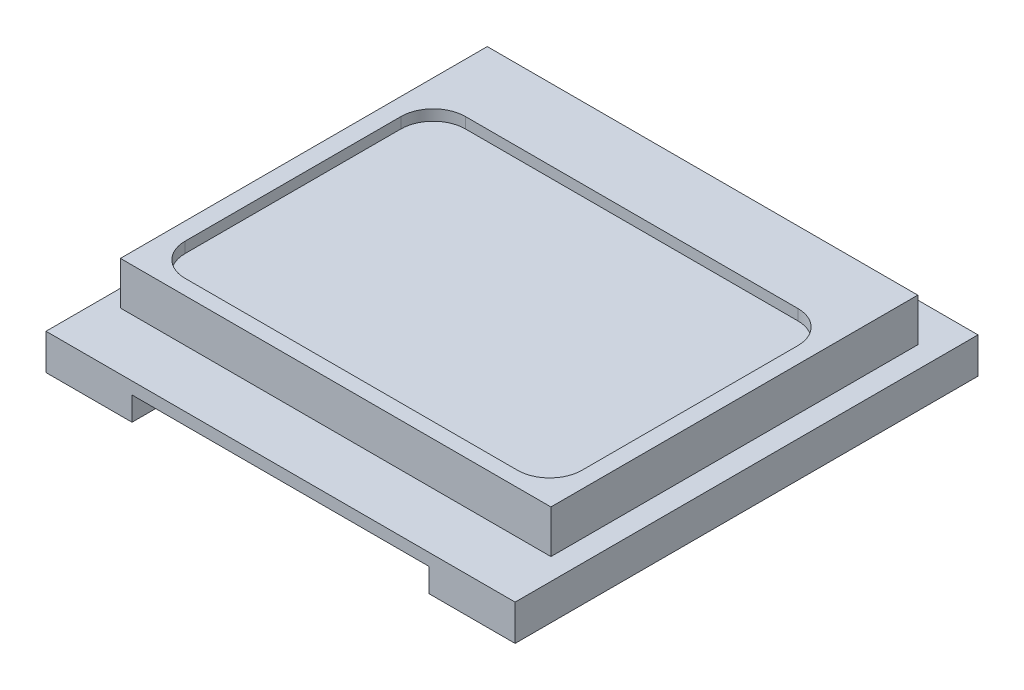
ISO-10303-21;
HEADER;
FILE_DESCRIPTION(('STEP AP214'),'2;1');
FILE_NAME('part.step','',(''),(''),'','','');
FILE_SCHEMA(('AUTOMOTIVE_DESIGN { 1 0 10303 214 1 1 1 1 }'));
ENDSEC;
DATA;
#1=APPLICATION_CONTEXT('core data for automotive mechanical design processes');
#2=APPLICATION_PROTOCOL_DEFINITION('international standard','automotive_design',2000,#1);
#3=PRODUCT_CONTEXT('',#1,'mechanical');
#4=PRODUCT('Part','Part','',(#3));
#5=PRODUCT_RELATED_PRODUCT_CATEGORY('part','',(#4));
#6=PRODUCT_DEFINITION_FORMATION('','',#4);
#7=PRODUCT_DEFINITION_CONTEXT('part definition',#1,'design');
#8=PRODUCT_DEFINITION('design','',#6,#7);
#9=PRODUCT_DEFINITION_SHAPE('','',#8);
#10=(LENGTH_UNIT() NAMED_UNIT(*) SI_UNIT(.MILLI.,.METRE.));
#11=(NAMED_UNIT(*) PLANE_ANGLE_UNIT() SI_UNIT($,.RADIAN.));
#12=(NAMED_UNIT(*) SI_UNIT($,.STERADIAN.) SOLID_ANGLE_UNIT());
#13=UNCERTAINTY_MEASURE_WITH_UNIT(LENGTH_MEASURE(1.E-05),#10,'distance_accuracy_value','');
#14=(GEOMETRIC_REPRESENTATION_CONTEXT(3) GLOBAL_UNCERTAINTY_ASSIGNED_CONTEXT((#13)) GLOBAL_UNIT_ASSIGNED_CONTEXT((#10,
#11,#12)) REPRESENTATION_CONTEXT('',''));
#15=CARTESIAN_POINT('',(0.,0.,0.));
#16=DIRECTION('',(0.,0.,1.));
#17=DIRECTION('',(1.,0.,0.));
#18=AXIS2_PLACEMENT_3D('',#15,#16,#17);
#19=CARTESIAN_POINT('',(0.,0.,0.));
#20=DIRECTION('',(0.,1.,0.));
#21=DIRECTION('',(0.,0.,1.));
#22=AXIS2_PLACEMENT_3D('',#19,#20,#21);
#23=PLANE('',#22);
#24=DIRECTION('',(0.,0.,1.));
#25=VECTOR('',#24,1.);
#26=CARTESIAN_POINT('',(-13.815,0.,-21.525));
#27=LINE('',#26,#25);
#28=CARTESIAN_POINT('',(-13.815,0.,-21.525));
#29=VERTEX_POINT('',#28);
#30=CARTESIAN_POINT('',(-13.815,0.,21.525));
#31=VERTEX_POINT('',#30);
#32=EDGE_CURVE('E221',#29,#31,#27,.T.);
#33=ORIENTED_EDGE('',*,*,#32,.F.);
#34=DIRECTION('',(-1.,0.,0.));
#35=VECTOR('',#34,1.);
#36=CARTESIAN_POINT('',(-21.815,0.,-21.525));
#37=LINE('',#36,#35);
#38=CARTESIAN_POINT('',(-10.5,0.,-21.525));
#39=VERTEX_POINT('',#38);
#40=EDGE_CURVE('E286',#39,#29,#37,.T.);
#41=ORIENTED_EDGE('',*,*,#40,.F.);
#42=DIRECTION('',(0.,0.,-1.));
#43=VECTOR('',#42,1.);
#44=CARTESIAN_POINT('',(-10.5,0.,-21.525));
#45=LINE('',#44,#43);
#46=CARTESIAN_POINT('',(-10.5,0.,-12.525));
#47=VERTEX_POINT('',#46);
#48=EDGE_CURVE('E252',#47,#39,#45,.T.);
#49=ORIENTED_EDGE('',*,*,#48,.F.);
#50=DIRECTION('',(-1.,0.,0.));
#51=VECTOR('',#50,1.);
#52=CARTESIAN_POINT('',(10.5,0.,-12.525));
#53=LINE('',#52,#51);
#54=CARTESIAN_POINT('',(10.5,0.,-12.525));
#55=VERTEX_POINT('',#54);
#56=EDGE_CURVE('E58',#55,#47,#53,.T.);
#57=ORIENTED_EDGE('',*,*,#56,.F.);
#58=DIRECTION('',(0.,0.,1.));
#59=VECTOR('',#58,1.);
#60=CARTESIAN_POINT('',(10.5,0.,-21.525));
#61=LINE('',#60,#59);
#62=CARTESIAN_POINT('',(10.5,0.,-21.525));
#63=VERTEX_POINT('',#62);
#64=EDGE_CURVE('E247',#63,#55,#61,.T.);
#65=ORIENTED_EDGE('',*,*,#64,.F.);
#66=CARTESIAN_POINT('',(13.815,0.,-21.525));
#67=VERTEX_POINT('',#66);
#68=EDGE_CURVE('E36',#67,#63,#37,.T.);
#69=ORIENTED_EDGE('',*,*,#68,.F.);
#70=DIRECTION('',(0.,0.,-1.));
#71=VECTOR('',#70,1.);
#72=CARTESIAN_POINT('',(13.815,0.,-21.525));
#73=LINE('',#72,#71);
#74=CARTESIAN_POINT('',(13.815,0.,21.525));
#75=VERTEX_POINT('',#74);
#76=EDGE_CURVE('E229',#75,#67,#73,.T.);
#77=ORIENTED_EDGE('',*,*,#76,.F.);
#78=DIRECTION('',(1.,0.,0.));
#79=VECTOR('',#78,1.);
#80=CARTESIAN_POINT('',(-21.815,0.,21.525));
#81=LINE('',#80,#79);
#82=EDGE_CURVE('E294',#31,#75,#81,.T.);
#83=ORIENTED_EDGE('',*,*,#82,.F.);
#84=EDGE_LOOP('',(#33,#41,#49,#57,#65,#69,#77,#83));
#85=FACE_BOUND('',#84,.T.);
#86=ADVANCED_FACE('F32',(#85),#23,.F.);
#87=CARTESIAN_POINT('',(0.,1.13,0.));
#88=DIRECTION('',(0.,1.,0.));
#89=DIRECTION('',(0.,0.,1.));
#90=AXIS2_PLACEMENT_3D('',#87,#88,#89);
#91=PLANE('',#90);
#92=DIRECTION('',(0.,0.,-1.));
#93=VECTOR('',#92,1.);
#94=CARTESIAN_POINT('',(21.815,1.13,-21.525));
#95=LINE('',#94,#93);
#96=CARTESIAN_POINT('',(21.815,1.13,21.525));
#97=VERTEX_POINT('',#96);
#98=CARTESIAN_POINT('',(21.815,1.13,-21.525));
#99=VERTEX_POINT('',#98);
#100=EDGE_CURVE('E297',#97,#99,#95,.T.);
#101=ORIENTED_EDGE('',*,*,#100,.T.);
#102=DIRECTION('',(-1.,0.,0.));
#103=VECTOR('',#102,1.);
#104=CARTESIAN_POINT('',(-21.815,1.13,-21.525));
#105=LINE('',#104,#103);
#106=CARTESIAN_POINT('',(-21.815,1.13,-21.525));
#107=VERTEX_POINT('',#106);
#108=EDGE_CURVE('E409',#99,#107,#105,.T.);
#109=ORIENTED_EDGE('',*,*,#108,.T.);
#110=DIRECTION('',(0.,0.,1.));
#111=VECTOR('',#110,1.);
#112=CARTESIAN_POINT('',(-21.815,1.13,-21.525));
#113=LINE('',#112,#111);
#114=CARTESIAN_POINT('',(-21.815,1.13,21.525));
#115=VERTEX_POINT('',#114);
#116=EDGE_CURVE('E204',#107,#115,#113,.T.);
#117=ORIENTED_EDGE('',*,*,#116,.T.);
#118=DIRECTION('',(1.,0.,0.));
#119=VECTOR('',#118,1.);
#120=CARTESIAN_POINT('',(-21.815,1.13,21.525));
#121=LINE('',#120,#119);
#122=EDGE_CURVE('E292',#115,#97,#121,.T.);
#123=ORIENTED_EDGE('',*,*,#122,.T.);
#124=EDGE_LOOP('',(#101,#109,#117,#123));
#125=FACE_BOUND('',#124,.T.);
#126=DIRECTION('',(1.,0.,0.));
#127=VECTOR('',#126,1.);
#128=CARTESIAN_POINT('',(-20.225,1.13,16.195));
#129=LINE('',#128,#127);
#130=CARTESIAN_POINT('',(-20.225,1.13,16.195));
#131=VERTEX_POINT('',#130);
#132=CARTESIAN_POINT('',(19.815,1.13,16.195));
#133=VERTEX_POINT('',#132);
#134=EDGE_CURVE('E393',#131,#133,#129,.T.);
#135=ORIENTED_EDGE('',*,*,#134,.F.);
#136=DIRECTION('',(0.,0.,1.));
#137=VECTOR('',#136,1.);
#138=CARTESIAN_POINT('',(-20.225,1.13,-17.925));
#139=LINE('',#138,#137);
#140=CARTESIAN_POINT('',(-20.225,1.13,-17.925));
#141=VERTEX_POINT('',#140);
#142=EDGE_CURVE('E373',#141,#131,#139,.T.);
#143=ORIENTED_EDGE('',*,*,#142,.F.);
#144=DIRECTION('',(-1.,0.,0.));
#145=VECTOR('',#144,1.);
#146=CARTESIAN_POINT('',(-20.225,1.13,-17.925));
#147=LINE('',#146,#145);
#148=CARTESIAN_POINT('',(19.815,1.13,-17.925));
#149=VERTEX_POINT('',#148);
#150=EDGE_CURVE('E384',#149,#141,#147,.T.);
#151=ORIENTED_EDGE('',*,*,#150,.F.);
#152=DIRECTION('',(0.,0.,-1.));
#153=VECTOR('',#152,1.);
#154=CARTESIAN_POINT('',(19.815,1.13,-17.925));
#155=LINE('',#154,#153);
#156=EDGE_CURVE('E395',#133,#149,#155,.T.);
#157=ORIENTED_EDGE('',*,*,#156,.F.);
#158=EDGE_LOOP('',(#135,#143,#151,#157));
#159=FACE_BOUND('',#158,.T.);
#160=ADVANCED_FACE('F413',(#125,#159),#91,.T.);
#161=CARTESIAN_POINT('',(21.815,1.13,-21.525));
#162=DIRECTION('',(-1.,0.,0.));
#163=DIRECTION('',(0.,0.,1.));
#164=AXIS2_PLACEMENT_3D('',#161,#162,#163);
#165=PLANE('',#164);
#166=DIRECTION('',(0.,-1.,0.));
#167=VECTOR('',#166,1.);
#168=CARTESIAN_POINT('',(21.815,1.13,21.525));
#169=LINE('',#168,#167);
#170=CARTESIAN_POINT('',(21.815,-2.2,21.525));
#171=VERTEX_POINT('',#170);
#172=EDGE_CURVE('E298',#97,#171,#169,.T.);
#173=ORIENTED_EDGE('',*,*,#172,.T.);
#174=DIRECTION('',(0.,0.,1.));
#175=VECTOR('',#174,1.);
#176=CARTESIAN_POINT('',(21.815,-2.2,-21.525));
#177=LINE('',#176,#175);
#178=CARTESIAN_POINT('',(21.815,-2.2,-21.525));
#179=VERTEX_POINT('',#178);
#180=EDGE_CURVE('E230',#179,#171,#177,.T.);
#181=ORIENTED_EDGE('',*,*,#180,.F.);
#182=DIRECTION('',(0.,-1.,0.));
#183=VECTOR('',#182,1.);
#184=CARTESIAN_POINT('',(21.815,1.13,-21.525));
#185=LINE('',#184,#183);
#186=EDGE_CURVE('E206',#99,#179,#185,.T.);
#187=ORIENTED_EDGE('',*,*,#186,.F.);
#188=ORIENTED_EDGE('',*,*,#100,.F.);
#189=EDGE_LOOP('',(#173,#181,#187,#188));
#190=FACE_BOUND('',#189,.T.);
#191=ADVANCED_FACE('F422',(#190),#165,.F.);
#192=CARTESIAN_POINT('',(-21.815,1.13,-21.525));
#193=DIRECTION('',(0.,0.,1.));
#194=DIRECTION('',(1.,0.,0.));
#195=AXIS2_PLACEMENT_3D('',#192,#193,#194);
#196=PLANE('',#195);
#197=ORIENTED_EDGE('',*,*,#186,.T.);
#198=DIRECTION('',(1.,0.,0.));
#199=VECTOR('',#198,1.);
#200=CARTESIAN_POINT('',(13.815,-2.2,-21.525));
#201=LINE('',#200,#199);
#202=CARTESIAN_POINT('',(13.815,-2.2,-21.525));
#203=VERTEX_POINT('',#202);
#204=EDGE_CURVE('E237',#203,#179,#201,.T.);
#205=ORIENTED_EDGE('',*,*,#204,.F.);
#206=DIRECTION('',(0.,1.,0.));
#207=VECTOR('',#206,1.);
#208=CARTESIAN_POINT('',(13.815,-2.2,-21.525));
#209=LINE('',#208,#207);
#210=EDGE_CURVE('E240',#203,#67,#209,.T.);
#211=ORIENTED_EDGE('',*,*,#210,.T.);
#212=ORIENTED_EDGE('',*,*,#68,.T.);
#213=DIRECTION('',(0.,1.,0.));
#214=VECTOR('',#213,1.);
#215=CARTESIAN_POINT('',(10.5,-10.,-21.525));
#216=LINE('',#215,#214);
#217=CARTESIAN_POINT('',(10.5,-10.,-21.525));
#218=VERTEX_POINT('',#217);
#219=EDGE_CURVE('E258',#218,#63,#216,.T.);
#220=ORIENTED_EDGE('',*,*,#219,.F.);
#221=DIRECTION('',(1.,0.,0.));
#222=VECTOR('',#221,1.);
#223=CARTESIAN_POINT('',(10.5,-10.,-21.525));
#224=LINE('',#223,#222);
#225=CARTESIAN_POINT('',(-10.5,-10.,-21.525));
#226=VERTEX_POINT('',#225);
#227=EDGE_CURVE('E256',#226,#218,#224,.T.);
#228=ORIENTED_EDGE('',*,*,#227,.F.);
#229=DIRECTION('',(0.,1.,0.));
#230=VECTOR('',#229,1.);
#231=CARTESIAN_POINT('',(-10.5,-10.,-21.525));
#232=LINE('',#231,#230);
#233=EDGE_CURVE('E270',#226,#39,#232,.T.);
#234=ORIENTED_EDGE('',*,*,#233,.T.);
#235=ORIENTED_EDGE('',*,*,#40,.T.);
#236=DIRECTION('',(0.,1.,0.));
#237=VECTOR('',#236,1.);
#238=CARTESIAN_POINT('',(-13.815,-2.2,-21.525));
#239=LINE('',#238,#237);
#240=CARTESIAN_POINT('',(-13.815,-2.2,-21.525));
#241=VERTEX_POINT('',#240);
#242=EDGE_CURVE('E213',#241,#29,#239,.T.);
#243=ORIENTED_EDGE('',*,*,#242,.F.);
#244=DIRECTION('',(1.,0.,0.));
#245=VECTOR('',#244,1.);
#246=CARTESIAN_POINT('',(-21.815,-2.2,-21.525));
#247=LINE('',#246,#245);
#248=CARTESIAN_POINT('',(-21.815,-2.2,-21.525));
#249=VERTEX_POINT('',#248);
#250=EDGE_CURVE('E210',#249,#241,#247,.T.);
#251=ORIENTED_EDGE('',*,*,#250,.F.);
#252=DIRECTION('',(0.,-1.,0.));
#253=VECTOR('',#252,1.);
#254=CARTESIAN_POINT('',(-21.815,1.13,-21.525));
#255=LINE('',#254,#253);
#256=EDGE_CURVE('E198',#107,#249,#255,.T.);
#257=ORIENTED_EDGE('',*,*,#256,.F.);
#258=ORIENTED_EDGE('',*,*,#108,.F.);
#259=EDGE_LOOP('',(#197,#205,#211,#212,#220,#228,#234,#235,#243,#251,#257,#258));
#260=FACE_BOUND('',#259,.T.);
#261=ADVANCED_FACE('F211',(#260),#196,.F.);
#262=CARTESIAN_POINT('',(-21.815,1.13,-21.525));
#263=DIRECTION('',(1.,0.,0.));
#264=DIRECTION('',(0.,0.,-1.));
#265=AXIS2_PLACEMENT_3D('',#262,#263,#264);
#266=PLANE('',#265);
#267=ORIENTED_EDGE('',*,*,#256,.T.);
#268=DIRECTION('',(0.,0.,-1.));
#269=VECTOR('',#268,1.);
#270=CARTESIAN_POINT('',(-21.815,-2.2,-21.525));
#271=LINE('',#270,#269);
#272=CARTESIAN_POINT('',(-21.815,-2.2,21.525));
#273=VERTEX_POINT('',#272);
#274=EDGE_CURVE('E203',#273,#249,#271,.T.);
#275=ORIENTED_EDGE('',*,*,#274,.F.);
#276=DIRECTION('',(0.,-1.,0.));
#277=VECTOR('',#276,1.);
#278=CARTESIAN_POINT('',(-21.815,1.13,21.525));
#279=LINE('',#278,#277);
#280=EDGE_CURVE('E207',#115,#273,#279,.T.);
#281=ORIENTED_EDGE('',*,*,#280,.F.);
#282=ORIENTED_EDGE('',*,*,#116,.F.);
#283=EDGE_LOOP('',(#267,#275,#281,#282));
#284=FACE_BOUND('',#283,.T.);
#285=ADVANCED_FACE('F200',(#284),#266,.F.);
#286=CARTESIAN_POINT('',(-21.815,1.13,21.525));
#287=DIRECTION('',(0.,0.,-1.));
#288=DIRECTION('',(-1.,0.,0.));
#289=AXIS2_PLACEMENT_3D('',#286,#287,#288);
#290=PLANE('',#289);
#291=ORIENTED_EDGE('',*,*,#280,.T.);
#292=DIRECTION('',(-1.,0.,0.));
#293=VECTOR('',#292,1.);
#294=CARTESIAN_POINT('',(-21.815,-2.2,21.525));
#295=LINE('',#294,#293);
#296=CARTESIAN_POINT('',(-13.815,-2.2,21.525));
#297=VERTEX_POINT('',#296);
#298=EDGE_CURVE('E220',#297,#273,#295,.T.);
#299=ORIENTED_EDGE('',*,*,#298,.F.);
#300=DIRECTION('',(0.,1.,0.));
#301=VECTOR('',#300,1.);
#302=CARTESIAN_POINT('',(-13.815,-2.2,21.525));
#303=LINE('',#302,#301);
#304=EDGE_CURVE('E50',#297,#31,#303,.T.);
#305=ORIENTED_EDGE('',*,*,#304,.T.);
#306=ORIENTED_EDGE('',*,*,#82,.T.);
#307=DIRECTION('',(0.,1.,0.));
#308=VECTOR('',#307,1.);
#309=CARTESIAN_POINT('',(13.815,-2.2,21.525));
#310=LINE('',#309,#308);
#311=CARTESIAN_POINT('',(13.815,-2.2,21.525));
#312=VERTEX_POINT('',#311);
#313=EDGE_CURVE('E244',#312,#75,#310,.T.);
#314=ORIENTED_EDGE('',*,*,#313,.F.);
#315=DIRECTION('',(-1.,0.,0.));
#316=VECTOR('',#315,1.);
#317=CARTESIAN_POINT('',(21.815,-2.2,21.525));
#318=LINE('',#317,#316);
#319=EDGE_CURVE('E233',#171,#312,#318,.T.);
#320=ORIENTED_EDGE('',*,*,#319,.F.);
#321=ORIENTED_EDGE('',*,*,#172,.F.);
#322=ORIENTED_EDGE('',*,*,#122,.F.);
#323=EDGE_LOOP('',(#291,#299,#305,#306,#314,#320,#321,#322));
#324=FACE_BOUND('',#323,.T.);
#325=ADVANCED_FACE('F418',(#324),#290,.F.);
#326=CARTESIAN_POINT('',(-20.225,5.13,-17.925));
#327=DIRECTION('',(1.,0.,0.));
#328=DIRECTION('',(0.,0.,-1.));
#329=AXIS2_PLACEMENT_3D('',#326,#327,#328);
#330=PLANE('',#329);
#331=ORIENTED_EDGE('',*,*,#142,.T.);
#332=DIRECTION('',(0.,-1.,0.));
#333=VECTOR('',#332,1.);
#334=CARTESIAN_POINT('',(-20.225,5.13,16.195));
#335=LINE('',#334,#333);
#336=CARTESIAN_POINT('',(-20.225,5.13,16.195));
#337=VERTEX_POINT('',#336);
#338=EDGE_CURVE('E287',#337,#131,#335,.T.);
#339=ORIENTED_EDGE('',*,*,#338,.F.);
#340=DIRECTION('',(0.,0.,1.));
#341=VECTOR('',#340,1.);
#342=CARTESIAN_POINT('',(-20.225,5.13,-17.925));
#343=LINE('',#342,#341);
#344=CARTESIAN_POINT('',(-20.225,5.13,-17.925));
#345=VERTEX_POINT('',#344);
#346=EDGE_CURVE('E380',#345,#337,#343,.T.);
#347=ORIENTED_EDGE('',*,*,#346,.F.);
#348=DIRECTION('',(0.,-1.,0.));
#349=VECTOR('',#348,1.);
#350=CARTESIAN_POINT('',(-20.225,5.13,-17.925));
#351=LINE('',#350,#349);
#352=EDGE_CURVE('E390',#345,#141,#351,.T.);
#353=ORIENTED_EDGE('',*,*,#352,.T.);
#354=EDGE_LOOP('',(#331,#339,#347,#353));
#355=FACE_BOUND('',#354,.T.);
#356=ADVANCED_FACE('F464',(#355),#330,.F.);
#357=CARTESIAN_POINT('',(-20.225,5.13,16.195));
#358=DIRECTION('',(0.,0.,-1.));
#359=DIRECTION('',(-1.,0.,0.));
#360=AXIS2_PLACEMENT_3D('',#357,#358,#359);
#361=PLANE('',#360);
#362=ORIENTED_EDGE('',*,*,#134,.T.);
#363=DIRECTION('',(0.,-1.,0.));
#364=VECTOR('',#363,1.);
#365=CARTESIAN_POINT('',(19.815,5.13,16.195));
#366=LINE('',#365,#364);
#367=CARTESIAN_POINT('',(19.815,5.13,16.195));
#368=VERTEX_POINT('',#367);
#369=EDGE_CURVE('E403',#368,#133,#366,.T.);
#370=ORIENTED_EDGE('',*,*,#369,.F.);
#371=DIRECTION('',(1.,0.,0.));
#372=VECTOR('',#371,1.);
#373=CARTESIAN_POINT('',(-20.225,5.13,16.195));
#374=LINE('',#373,#372);
#375=EDGE_CURVE('E383',#337,#368,#374,.T.);
#376=ORIENTED_EDGE('',*,*,#375,.F.);
#377=ORIENTED_EDGE('',*,*,#338,.T.);
#378=EDGE_LOOP('',(#362,#370,#376,#377));
#379=FACE_BOUND('',#378,.T.);
#380=ADVANCED_FACE('F522',(#379),#361,.F.);
#381=CARTESIAN_POINT('',(19.815,5.13,-17.925));
#382=DIRECTION('',(-1.,0.,0.));
#383=DIRECTION('',(0.,0.,1.));
#384=AXIS2_PLACEMENT_3D('',#381,#382,#383);
#385=PLANE('',#384);
#386=ORIENTED_EDGE('',*,*,#156,.T.);
#387=DIRECTION('',(0.,-1.,0.));
#388=VECTOR('',#387,1.);
#389=CARTESIAN_POINT('',(19.815,5.13,-17.925));
#390=LINE('',#389,#388);
#391=CARTESIAN_POINT('',(19.815,5.13,-17.925));
#392=VERTEX_POINT('',#391);
#393=EDGE_CURVE('E401',#392,#149,#390,.T.);
#394=ORIENTED_EDGE('',*,*,#393,.F.);
#395=DIRECTION('',(0.,0.,-1.));
#396=VECTOR('',#395,1.);
#397=CARTESIAN_POINT('',(19.815,5.13,-17.925));
#398=LINE('',#397,#396);
#399=EDGE_CURVE('E386',#368,#392,#398,.T.);
#400=ORIENTED_EDGE('',*,*,#399,.F.);
#401=ORIENTED_EDGE('',*,*,#369,.T.);
#402=EDGE_LOOP('',(#386,#394,#400,#401));
#403=FACE_BOUND('',#402,.T.);
#404=ADVANCED_FACE('F518',(#403),#385,.F.);
#405=CARTESIAN_POINT('',(-20.225,5.13,-17.925));
#406=DIRECTION('',(0.,0.,1.));
#407=DIRECTION('',(1.,0.,0.));
#408=AXIS2_PLACEMENT_3D('',#405,#406,#407);
#409=PLANE('',#408);
#410=ORIENTED_EDGE('',*,*,#150,.T.);
#411=ORIENTED_EDGE('',*,*,#352,.F.);
#412=DIRECTION('',(-1.,0.,0.));
#413=VECTOR('',#412,1.);
#414=CARTESIAN_POINT('',(-20.225,5.13,-17.925));
#415=LINE('',#414,#413);
#416=EDGE_CURVE('E388',#392,#345,#415,.T.);
#417=ORIENTED_EDGE('',*,*,#416,.F.);
#418=ORIENTED_EDGE('',*,*,#393,.T.);
#419=EDGE_LOOP('',(#410,#411,#417,#418));
#420=FACE_BOUND('',#419,.T.);
#421=ADVANCED_FACE('F515',(#420),#409,.F.);
#422=CARTESIAN_POINT('',(0.,5.13,0.));
#423=DIRECTION('',(0.,1.,0.));
#424=DIRECTION('',(0.,0.,1.));
#425=AXIS2_PLACEMENT_3D('',#422,#423,#424);
#426=PLANE('',#425);
#427=DIRECTION('',(0.,0.,1.));
#428=VECTOR('',#427,1.);
#429=CARTESIAN_POINT('',(-18.605,5.13,-11.275));
#430=LINE('',#429,#428);
#431=CARTESIAN_POINT('',(-18.605,5.13,-8.275));
#432=VERTEX_POINT('',#431);
#433=CARTESIAN_POINT('',(-18.605,5.13,11.795));
#434=VERTEX_POINT('',#433);
#435=EDGE_CURVE('E341',#432,#434,#430,.T.);
#436=ORIENTED_EDGE('',*,*,#435,.F.);
#437=CARTESIAN_POINT('',(-15.605,5.13,-8.275));
#438=DIRECTION('',(0.,1.,0.));
#439=DIRECTION('',(0.,0.,1.));
#440=AXIS2_PLACEMENT_3D('',#437,#438,#439);
#441=CIRCLE('',#440,3.);
#442=CARTESIAN_POINT('',(-15.605,5.13,-11.275));
#443=VERTEX_POINT('',#442);
#444=EDGE_CURVE('E42',#432,#443,#441,.F.);
#445=ORIENTED_EDGE('',*,*,#444,.T.);
#446=DIRECTION('',(-1.,0.,0.));
#447=VECTOR('',#446,1.);
#448=CARTESIAN_POINT('',(-18.605,5.13,-11.275));
#449=LINE('',#448,#447);
#450=CARTESIAN_POINT('',(15.305,5.13,-11.275));
#451=VERTEX_POINT('',#450);
#452=EDGE_CURVE('E339',#451,#443,#449,.T.);
#453=ORIENTED_EDGE('',*,*,#452,.F.);
#454=CARTESIAN_POINT('',(15.305,5.13,-8.275));
#455=DIRECTION('',(0.,1.,0.));
#456=DIRECTION('',(0.,0.,1.));
#457=AXIS2_PLACEMENT_3D('',#454,#455,#456);
#458=CIRCLE('',#457,3.);
#459=CARTESIAN_POINT('',(18.305,5.13,-8.275));
#460=VERTEX_POINT('',#459);
#461=EDGE_CURVE('E11',#451,#460,#458,.F.);
#462=ORIENTED_EDGE('',*,*,#461,.T.);
#463=DIRECTION('',(0.,0.,-1.));
#464=VECTOR('',#463,1.);
#465=CARTESIAN_POINT('',(18.305,5.13,-11.275));
#466=LINE('',#465,#464);
#467=CARTESIAN_POINT('',(18.305,5.13,11.795));
#468=VERTEX_POINT('',#467);
#469=EDGE_CURVE('E351',#468,#460,#466,.T.);
#470=ORIENTED_EDGE('',*,*,#469,.F.);
#471=CARTESIAN_POINT('',(15.305,5.13,11.795));
#472=DIRECTION('',(0.,1.,0.));
#473=DIRECTION('',(0.,0.,1.));
#474=AXIS2_PLACEMENT_3D('',#471,#472,#473);
#475=CIRCLE('',#474,3.);
#476=CARTESIAN_POINT('',(15.305,5.13,14.795));
#477=VERTEX_POINT('',#476);
#478=EDGE_CURVE('E332',#468,#477,#475,.F.);
#479=ORIENTED_EDGE('',*,*,#478,.T.);
#480=DIRECTION('',(1.,0.,0.));
#481=VECTOR('',#480,1.);
#482=CARTESIAN_POINT('',(-18.605,5.13,14.795));
#483=LINE('',#482,#481);
#484=CARTESIAN_POINT('',(-15.605,5.13,14.795));
#485=VERTEX_POINT('',#484);
#486=EDGE_CURVE('E375',#485,#477,#483,.T.);
#487=ORIENTED_EDGE('',*,*,#486,.F.);
#488=CARTESIAN_POINT('',(-15.605,5.13,11.795));
#489=DIRECTION('',(0.,1.,0.));
#490=DIRECTION('',(0.,0.,1.));
#491=AXIS2_PLACEMENT_3D('',#488,#489,#490);
#492=CIRCLE('',#491,3.);
#493=EDGE_CURVE('E330',#485,#434,#492,.F.);
#494=ORIENTED_EDGE('',*,*,#493,.T.);
#495=EDGE_LOOP('',(#436,#445,#453,#462,#470,#479,#487,#494));
#496=FACE_BOUND('',#495,.T.);
#497=ORIENTED_EDGE('',*,*,#346,.T.);
#498=ORIENTED_EDGE('',*,*,#375,.T.);
#499=ORIENTED_EDGE('',*,*,#399,.T.);
#500=ORIENTED_EDGE('',*,*,#416,.T.);
#501=EDGE_LOOP('',(#497,#498,#499,#500));
#502=FACE_BOUND('',#501,.T.);
#503=ADVANCED_FACE('F337',(#496,#502),#426,.T.);
#504=CARTESIAN_POINT('',(-18.605,4.13,-11.275));
#505=DIRECTION('',(-1.,0.,0.));
#506=DIRECTION('',(0.,0.,1.));
#507=AXIS2_PLACEMENT_3D('',#504,#505,#506);
#508=PLANE('',#507);
#509=ORIENTED_EDGE('',*,*,#435,.T.);
#510=DIRECTION('',(0.,1.,0.));
#511=VECTOR('',#510,1.);
#512=CARTESIAN_POINT('',(-18.605,4.13,11.795));
#513=LINE('',#512,#511);
#514=CARTESIAN_POINT('',(-18.605,4.13,11.795));
#515=VERTEX_POINT('',#514);
#516=EDGE_CURVE('E310',#434,#515,#513,.F.);
#517=ORIENTED_EDGE('',*,*,#516,.T.);
#518=DIRECTION('',(0.,0.,1.));
#519=VECTOR('',#518,1.);
#520=CARTESIAN_POINT('',(-18.605,4.13,-11.275));
#521=LINE('',#520,#519);
#522=CARTESIAN_POINT('',(-18.605,4.13,-8.275));
#523=VERTEX_POINT('',#522);
#524=EDGE_CURVE('E350',#523,#515,#521,.T.);
#525=ORIENTED_EDGE('',*,*,#524,.F.);
#526=DIRECTION('',(0.,1.,0.));
#527=VECTOR('',#526,1.);
#528=CARTESIAN_POINT('',(-18.605,5.13,-8.275));
#529=LINE('',#528,#527);
#530=EDGE_CURVE('E307',#523,#432,#529,.T.);
#531=ORIENTED_EDGE('',*,*,#530,.T.);
#532=EDGE_LOOP('',(#509,#517,#525,#531));
#533=FACE_BOUND('',#532,.T.);
#534=ADVANCED_FACE('F362',(#533),#508,.F.);
#535=CARTESIAN_POINT('',(-18.605,4.13,-11.275));
#536=DIRECTION('',(0.,0.,-1.));
#537=DIRECTION('',(-1.,0.,0.));
#538=AXIS2_PLACEMENT_3D('',#535,#536,#537);
#539=PLANE('',#538);
#540=ORIENTED_EDGE('',*,*,#452,.T.);
#541=DIRECTION('',(0.,1.,0.));
#542=VECTOR('',#541,1.);
#543=CARTESIAN_POINT('',(-15.605,4.13,-11.275));
#544=LINE('',#543,#542);
#545=CARTESIAN_POINT('',(-15.605,4.13,-11.275));
#546=VERTEX_POINT('',#545);
#547=EDGE_CURVE('E328',#443,#546,#544,.F.);
#548=ORIENTED_EDGE('',*,*,#547,.T.);
#549=DIRECTION('',(-1.,0.,0.));
#550=VECTOR('',#549,1.);
#551=CARTESIAN_POINT('',(-18.605,4.13,-11.275));
#552=LINE('',#551,#550);
#553=CARTESIAN_POINT('',(15.305,4.13,-11.275));
#554=VERTEX_POINT('',#553);
#555=EDGE_CURVE('E360',#554,#546,#552,.T.);
#556=ORIENTED_EDGE('',*,*,#555,.F.);
#557=DIRECTION('',(0.,1.,0.));
#558=VECTOR('',#557,1.);
#559=CARTESIAN_POINT('',(15.305,5.13,-11.275));
#560=LINE('',#559,#558);
#561=EDGE_CURVE('E325',#554,#451,#560,.T.);
#562=ORIENTED_EDGE('',*,*,#561,.T.);
#563=EDGE_LOOP('',(#540,#548,#556,#562));
#564=FACE_BOUND('',#563,.T.);
#565=ADVANCED_FACE('F346',(#564),#539,.F.);
#566=CARTESIAN_POINT('',(18.305,4.13,-11.275));
#567=DIRECTION('',(1.,0.,0.));
#568=DIRECTION('',(0.,0.,-1.));
#569=AXIS2_PLACEMENT_3D('',#566,#567,#568);
#570=PLANE('',#569);
#571=DIRECTION('',(0.,0.,-1.));
#572=VECTOR('',#571,1.);
#573=CARTESIAN_POINT('',(18.305,4.13,-11.275));
#574=LINE('',#573,#572);
#575=CARTESIAN_POINT('',(18.305,4.13,11.795));
#576=VERTEX_POINT('',#575);
#577=CARTESIAN_POINT('',(18.305,4.13,-8.275));
#578=VERTEX_POINT('',#577);
#579=EDGE_CURVE('E367',#576,#578,#574,.T.);
#580=ORIENTED_EDGE('',*,*,#579,.F.);
#581=DIRECTION('',(0.,1.,0.));
#582=VECTOR('',#581,1.);
#583=CARTESIAN_POINT('',(18.305,5.13,11.795));
#584=LINE('',#583,#582);
#585=EDGE_CURVE('E322',#576,#468,#584,.T.);
#586=ORIENTED_EDGE('',*,*,#585,.T.);
#587=ORIENTED_EDGE('',*,*,#469,.T.);
#588=DIRECTION('',(0.,1.,0.));
#589=VECTOR('',#588,1.);
#590=CARTESIAN_POINT('',(18.305,4.13,-8.275));
#591=LINE('',#590,#589);
#592=EDGE_CURVE('E320',#460,#578,#591,.F.);
#593=ORIENTED_EDGE('',*,*,#592,.T.);
#594=EDGE_LOOP('',(#580,#586,#587,#593));
#595=FACE_BOUND('',#594,.T.);
#596=ADVANCED_FACE('F493',(#595),#570,.F.);
#597=CARTESIAN_POINT('',(-18.605,4.13,14.795));
#598=DIRECTION('',(0.,0.,1.));
#599=DIRECTION('',(1.,0.,0.));
#600=AXIS2_PLACEMENT_3D('',#597,#598,#599);
#601=PLANE('',#600);
#602=DIRECTION('',(1.,0.,0.));
#603=VECTOR('',#602,1.);
#604=CARTESIAN_POINT('',(-18.605,4.13,14.795));
#605=LINE('',#604,#603);
#606=CARTESIAN_POINT('',(-15.605,4.13,14.795));
#607=VERTEX_POINT('',#606);
#608=CARTESIAN_POINT('',(15.305,4.13,14.795));
#609=VERTEX_POINT('',#608);
#610=EDGE_CURVE('E364',#607,#609,#605,.T.);
#611=ORIENTED_EDGE('',*,*,#610,.F.);
#612=DIRECTION('',(0.,1.,0.));
#613=VECTOR('',#612,1.);
#614=CARTESIAN_POINT('',(-15.605,5.13,14.795));
#615=LINE('',#614,#613);
#616=EDGE_CURVE('E304',#607,#485,#615,.T.);
#617=ORIENTED_EDGE('',*,*,#616,.T.);
#618=ORIENTED_EDGE('',*,*,#486,.T.);
#619=DIRECTION('',(0.,1.,0.));
#620=VECTOR('',#619,1.);
#621=CARTESIAN_POINT('',(15.305,4.13,14.795));
#622=LINE('',#621,#620);
#623=EDGE_CURVE('E302',#477,#609,#622,.F.);
#624=ORIENTED_EDGE('',*,*,#623,.T.);
#625=EDGE_LOOP('',(#611,#617,#618,#624));
#626=FACE_BOUND('',#625,.T.);
#627=ADVANCED_FACE('F499',(#626),#601,.F.);
#628=CARTESIAN_POINT('',(0.,4.13,0.));
#629=DIRECTION('',(0.,1.,0.));
#630=DIRECTION('',(0.,0.,1.));
#631=AXIS2_PLACEMENT_3D('',#628,#629,#630);
#632=PLANE('',#631);
#633=ORIENTED_EDGE('',*,*,#524,.T.);
#634=CARTESIAN_POINT('',(-15.605,4.13,11.795));
#635=DIRECTION('',(0.,1.,0.));
#636=DIRECTION('',(0.,0.,1.));
#637=AXIS2_PLACEMENT_3D('',#634,#635,#636);
#638=CIRCLE('',#637,3.);
#639=EDGE_CURVE('E318',#515,#607,#638,.T.);
#640=ORIENTED_EDGE('',*,*,#639,.T.);
#641=ORIENTED_EDGE('',*,*,#610,.T.);
#642=CARTESIAN_POINT('',(15.305,4.13,11.795));
#643=DIRECTION('',(0.,1.,0.));
#644=DIRECTION('',(0.,0.,1.));
#645=AXIS2_PLACEMENT_3D('',#642,#643,#644);
#646=CIRCLE('',#645,3.);
#647=EDGE_CURVE('E316',#609,#576,#646,.T.);
#648=ORIENTED_EDGE('',*,*,#647,.T.);
#649=ORIENTED_EDGE('',*,*,#579,.T.);
#650=CARTESIAN_POINT('',(15.305,4.13,-8.275));
#651=DIRECTION('',(0.,1.,0.));
#652=DIRECTION('',(0.,0.,1.));
#653=AXIS2_PLACEMENT_3D('',#650,#651,#652);
#654=CIRCLE('',#653,3.);
#655=EDGE_CURVE('E312',#578,#554,#654,.T.);
#656=ORIENTED_EDGE('',*,*,#655,.T.);
#657=ORIENTED_EDGE('',*,*,#555,.T.);
#658=CARTESIAN_POINT('',(-15.605,4.13,-8.275));
#659=DIRECTION('',(0.,1.,0.));
#660=DIRECTION('',(0.,0.,1.));
#661=AXIS2_PLACEMENT_3D('',#658,#659,#660);
#662=CIRCLE('',#661,3.);
#663=EDGE_CURVE('E314',#546,#523,#662,.T.);
#664=ORIENTED_EDGE('',*,*,#663,.T.);
#665=EDGE_LOOP('',(#633,#640,#641,#648,#649,#656,#657,#664));
#666=FACE_BOUND('',#665,.T.);
#667=ADVANCED_FACE('F358',(#666),#632,.T.);
#668=CARTESIAN_POINT('',(-15.605,4.13,11.795));
#669=DIRECTION('',(0.,-1.,0.));
#670=DIRECTION('',(0.,0.,-1.));
#671=AXIS2_PLACEMENT_3D('',#668,#669,#670);
#672=CYLINDRICAL_SURFACE('',#671,3.);
#673=ORIENTED_EDGE('',*,*,#639,.F.);
#674=ORIENTED_EDGE('',*,*,#516,.F.);
#675=ORIENTED_EDGE('',*,*,#493,.F.);
#676=ORIENTED_EDGE('',*,*,#616,.F.);
#677=EDGE_LOOP('',(#673,#674,#675,#676));
#678=FACE_BOUND('',#677,.T.);
#679=ADVANCED_FACE('F471',(#678),#672,.F.);
#680=CARTESIAN_POINT('',(15.305,4.13,11.795));
#681=DIRECTION('',(0.,-1.,0.));
#682=DIRECTION('',(0.,0.,-1.));
#683=AXIS2_PLACEMENT_3D('',#680,#681,#682);
#684=CYLINDRICAL_SURFACE('',#683,3.);
#685=ORIENTED_EDGE('',*,*,#647,.F.);
#686=ORIENTED_EDGE('',*,*,#623,.F.);
#687=ORIENTED_EDGE('',*,*,#478,.F.);
#688=ORIENTED_EDGE('',*,*,#585,.F.);
#689=EDGE_LOOP('',(#685,#686,#687,#688));
#690=FACE_BOUND('',#689,.T.);
#691=ADVANCED_FACE('F474',(#690),#684,.F.);
#692=CARTESIAN_POINT('',(-15.605,4.13,-8.275));
#693=DIRECTION('',(0.,-1.,0.));
#694=DIRECTION('',(0.,0.,-1.));
#695=AXIS2_PLACEMENT_3D('',#692,#693,#694);
#696=CYLINDRICAL_SURFACE('',#695,3.);
#697=ORIENTED_EDGE('',*,*,#663,.F.);
#698=ORIENTED_EDGE('',*,*,#547,.F.);
#699=ORIENTED_EDGE('',*,*,#444,.F.);
#700=ORIENTED_EDGE('',*,*,#530,.F.);
#701=EDGE_LOOP('',(#697,#698,#699,#700));
#702=FACE_BOUND('',#701,.T.);
#703=ADVANCED_FACE('F354',(#702),#696,.F.);
#704=CARTESIAN_POINT('',(15.305,4.13,-8.275));
#705=DIRECTION('',(0.,-1.,0.));
#706=DIRECTION('',(0.,0.,-1.));
#707=AXIS2_PLACEMENT_3D('',#704,#705,#706);
#708=CYLINDRICAL_SURFACE('',#707,3.);
#709=ORIENTED_EDGE('',*,*,#655,.F.);
#710=ORIENTED_EDGE('',*,*,#592,.F.);
#711=ORIENTED_EDGE('',*,*,#461,.F.);
#712=ORIENTED_EDGE('',*,*,#561,.F.);
#713=EDGE_LOOP('',(#709,#710,#711,#712));
#714=FACE_BOUND('',#713,.T.);
#715=ADVANCED_FACE('F34',(#714),#708,.F.);
#716=CARTESIAN_POINT('',(10.5,-10.,-21.525));
#717=DIRECTION('',(-1.,0.,0.));
#718=DIRECTION('',(0.,0.,1.));
#719=AXIS2_PLACEMENT_3D('',#716,#717,#718);
#720=PLANE('',#719);
#721=ORIENTED_EDGE('',*,*,#64,.T.);
#722=DIRECTION('',(0.,1.,0.));
#723=VECTOR('',#722,1.);
#724=CARTESIAN_POINT('',(10.5,-10.,-12.525));
#725=LINE('',#724,#723);
#726=CARTESIAN_POINT('',(10.5,-10.,-12.525));
#727=VERTEX_POINT('',#726);
#728=EDGE_CURVE('E276',#727,#55,#725,.T.);
#729=ORIENTED_EDGE('',*,*,#728,.F.);
#730=DIRECTION('',(0.,0.,1.));
#731=VECTOR('',#730,1.);
#732=CARTESIAN_POINT('',(10.5,-10.,-21.525));
#733=LINE('',#732,#731);
#734=EDGE_CURVE('E248',#218,#727,#733,.T.);
#735=ORIENTED_EDGE('',*,*,#734,.F.);
#736=ORIENTED_EDGE('',*,*,#219,.T.);
#737=EDGE_LOOP('',(#721,#729,#735,#736));
#738=FACE_BOUND('',#737,.T.);
#739=ADVANCED_FACE('F435',(#738),#720,.F.);
#740=CARTESIAN_POINT('',(10.5,-10.,-12.525));
#741=DIRECTION('',(0.,0.,-1.));
#742=DIRECTION('',(-1.,0.,0.));
#743=AXIS2_PLACEMENT_3D('',#740,#741,#742);
#744=PLANE('',#743);
#745=ORIENTED_EDGE('',*,*,#56,.T.);
#746=DIRECTION('',(0.,1.,0.));
#747=VECTOR('',#746,1.);
#748=CARTESIAN_POINT('',(-10.5,-10.,-12.525));
#749=LINE('',#748,#747);
#750=CARTESIAN_POINT('',(-10.5,-10.,-12.525));
#751=VERTEX_POINT('',#750);
#752=EDGE_CURVE('E262',#751,#47,#749,.T.);
#753=ORIENTED_EDGE('',*,*,#752,.F.);
#754=DIRECTION('',(-1.,0.,0.));
#755=VECTOR('',#754,1.);
#756=CARTESIAN_POINT('',(10.5,-10.,-12.525));
#757=LINE('',#756,#755);
#758=EDGE_CURVE('E251',#727,#751,#757,.T.);
#759=ORIENTED_EDGE('',*,*,#758,.F.);
#760=ORIENTED_EDGE('',*,*,#728,.T.);
#761=EDGE_LOOP('',(#745,#753,#759,#760));
#762=FACE_BOUND('',#761,.T.);
#763=ADVANCED_FACE('F437',(#762),#744,.F.);
#764=CARTESIAN_POINT('',(-10.5,-10.,-21.525));
#765=DIRECTION('',(1.,0.,0.));
#766=DIRECTION('',(0.,0.,-1.));
#767=AXIS2_PLACEMENT_3D('',#764,#765,#766);
#768=PLANE('',#767);
#769=ORIENTED_EDGE('',*,*,#48,.T.);
#770=ORIENTED_EDGE('',*,*,#233,.F.);
#771=DIRECTION('',(0.,0.,-1.));
#772=VECTOR('',#771,1.);
#773=CARTESIAN_POINT('',(-10.5,-10.,-21.525));
#774=LINE('',#773,#772);
#775=EDGE_CURVE('E254',#751,#226,#774,.T.);
#776=ORIENTED_EDGE('',*,*,#775,.F.);
#777=ORIENTED_EDGE('',*,*,#752,.T.);
#778=EDGE_LOOP('',(#769,#770,#776,#777));
#779=FACE_BOUND('',#778,.T.);
#780=ADVANCED_FACE('F443',(#779),#768,.F.);
#781=CARTESIAN_POINT('',(0.,-10.,0.));
#782=DIRECTION('',(0.,-1.,0.));
#783=DIRECTION('',(0.,0.,-1.));
#784=AXIS2_PLACEMENT_3D('',#781,#782,#783);
#785=PLANE('',#784);
#786=ORIENTED_EDGE('',*,*,#734,.T.);
#787=ORIENTED_EDGE('',*,*,#758,.T.);
#788=ORIENTED_EDGE('',*,*,#775,.T.);
#789=ORIENTED_EDGE('',*,*,#227,.T.);
#790=EDGE_LOOP('',(#786,#787,#788,#789));
#791=FACE_BOUND('',#790,.T.);
#792=ADVANCED_FACE('F441',(#791),#785,.T.);
#793=CARTESIAN_POINT('',(13.815,-2.2,-21.525));
#794=DIRECTION('',(1.,0.,0.));
#795=DIRECTION('',(0.,0.,-1.));
#796=AXIS2_PLACEMENT_3D('',#793,#794,#795);
#797=PLANE('',#796);
#798=ORIENTED_EDGE('',*,*,#76,.T.);
#799=ORIENTED_EDGE('',*,*,#210,.F.);
#800=DIRECTION('',(0.,0.,-1.));
#801=VECTOR('',#800,1.);
#802=CARTESIAN_POINT('',(13.815,-2.2,-21.525));
#803=LINE('',#802,#801);
#804=EDGE_CURVE('E235',#312,#203,#803,.T.);
#805=ORIENTED_EDGE('',*,*,#804,.F.);
#806=ORIENTED_EDGE('',*,*,#313,.T.);
#807=EDGE_LOOP('',(#798,#799,#805,#806));
#808=FACE_BOUND('',#807,.T.);
#809=ADVANCED_FACE('F429',(#808),#797,.F.);
#810=CARTESIAN_POINT('',(0.,-2.2,0.));
#811=DIRECTION('',(0.,-1.,0.));
#812=DIRECTION('',(0.,0.,-1.));
#813=AXIS2_PLACEMENT_3D('',#810,#811,#812);
#814=PLANE('',#813);
#815=ORIENTED_EDGE('',*,*,#180,.T.);
#816=ORIENTED_EDGE('',*,*,#319,.T.);
#817=ORIENTED_EDGE('',*,*,#804,.T.);
#818=ORIENTED_EDGE('',*,*,#204,.T.);
#819=EDGE_LOOP('',(#815,#816,#817,#818));
#820=FACE_BOUND('',#819,.T.);
#821=ADVANCED_FACE('F425',(#820),#814,.T.);
#822=CARTESIAN_POINT('',(-13.815,-2.2,-21.525));
#823=DIRECTION('',(-1.,0.,0.));
#824=DIRECTION('',(0.,0.,1.));
#825=AXIS2_PLACEMENT_3D('',#822,#823,#824);
#826=PLANE('',#825);
#827=ORIENTED_EDGE('',*,*,#32,.T.);
#828=ORIENTED_EDGE('',*,*,#304,.F.);
#829=DIRECTION('',(0.,0.,1.));
#830=VECTOR('',#829,1.);
#831=CARTESIAN_POINT('',(-13.815,-2.2,-21.525));
#832=LINE('',#831,#830);
#833=EDGE_CURVE('E216',#241,#297,#832,.T.);
#834=ORIENTED_EDGE('',*,*,#833,.F.);
#835=ORIENTED_EDGE('',*,*,#242,.T.);
#836=EDGE_LOOP('',(#827,#828,#834,#835));
#837=FACE_BOUND('',#836,.T.);
#838=ADVANCED_FACE('F445',(#837),#826,.F.);
#839=CARTESIAN_POINT('',(0.,-2.2,0.));
#840=DIRECTION('',(0.,1.,0.));
#841=DIRECTION('',(0.,0.,1.));
#842=AXIS2_PLACEMENT_3D('',#839,#840,#841);
#843=PLANE('',#842);
#844=ORIENTED_EDGE('',*,*,#274,.T.);
#845=ORIENTED_EDGE('',*,*,#250,.T.);
#846=ORIENTED_EDGE('',*,*,#833,.T.);
#847=ORIENTED_EDGE('',*,*,#298,.T.);
#848=EDGE_LOOP('',(#844,#845,#846,#847));
#849=FACE_BOUND('',#848,.T.);
#850=ADVANCED_FACE('F219',(#849),#843,.F.);
#851=CLOSED_SHELL('',(#86,#160,#191,#261,#285,#325,#356,#380,#404,#421,#503,#534,#565,#596,#627,
#667,#679,#691,#703,#715,#739,#763,#780,#792,#809,#821,#838,#850));
#852=MANIFOLD_SOLID_BREP('B2',#851);
#853=ADVANCED_BREP_SHAPE_REPRESENTATION('',(#18,#852),#14);
#854=SHAPE_DEFINITION_REPRESENTATION(#9,#853);
ENDSEC;
END-ISO-10303-21;
